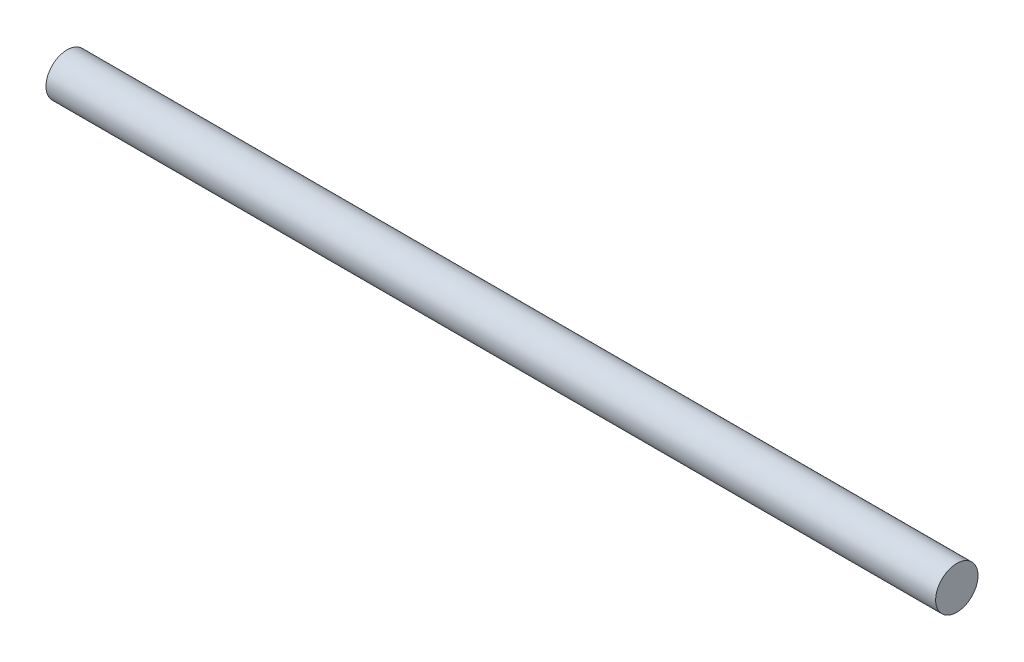
ISO-10303-21;
HEADER;
FILE_DESCRIPTION(('STEP AP214'),'2;1');
FILE_NAME('part.step','',(''),(''),'','','');
FILE_SCHEMA(('AUTOMOTIVE_DESIGN { 1 0 10303 214 1 1 1 1 }'));
ENDSEC;
DATA;
#1=APPLICATION_CONTEXT('core data for automotive mechanical design processes');
#2=APPLICATION_PROTOCOL_DEFINITION('international standard','automotive_design',2000,#1);
#3=PRODUCT_CONTEXT('',#1,'mechanical');
#4=PRODUCT('Part','Part','',(#3));
#5=PRODUCT_RELATED_PRODUCT_CATEGORY('part','',(#4));
#6=PRODUCT_DEFINITION_FORMATION('','',#4);
#7=PRODUCT_DEFINITION_CONTEXT('part definition',#1,'design');
#8=PRODUCT_DEFINITION('design','',#6,#7);
#9=PRODUCT_DEFINITION_SHAPE('','',#8);
#10=(LENGTH_UNIT() NAMED_UNIT(*) SI_UNIT(.MILLI.,.METRE.));
#11=(NAMED_UNIT(*) PLANE_ANGLE_UNIT() SI_UNIT($,.RADIAN.));
#12=(NAMED_UNIT(*) SI_UNIT($,.STERADIAN.) SOLID_ANGLE_UNIT());
#13=UNCERTAINTY_MEASURE_WITH_UNIT(LENGTH_MEASURE(1.E-05),#10,'distance_accuracy_value','');
#14=(GEOMETRIC_REPRESENTATION_CONTEXT(3) GLOBAL_UNCERTAINTY_ASSIGNED_CONTEXT((#13)) GLOBAL_UNIT_ASSIGNED_CONTEXT((#10,
#11,#12)) REPRESENTATION_CONTEXT('',''));
#15=CARTESIAN_POINT('',(0.,0.,0.));
#16=DIRECTION('',(0.,0.,1.));
#17=DIRECTION('',(1.,0.,0.));
#18=AXIS2_PLACEMENT_3D('',#15,#16,#17);
#19=CARTESIAN_POINT('',(200.,0.,0.));
#20=DIRECTION('',(-1.,0.,0.));
#21=DIRECTION('',(0.,0.,1.));
#22=AXIS2_PLACEMENT_3D('',#19,#20,#21);
#23=CYLINDRICAL_SURFACE('',#22,4.7625);
#24=CARTESIAN_POINT('',(200.,0.,0.));
#25=DIRECTION('',(1.,0.,0.));
#26=DIRECTION('',(0.,0.,-1.));
#27=AXIS2_PLACEMENT_3D('',#24,#25,#26);
#28=CIRCLE('',#27,4.7625);
#29=CARTESIAN_POINT('',(200.,0.,-4.7625));
#30=VERTEX_POINT('',#29);
#31=EDGE_CURVE('E10',#30,#30,#28,.T.);
#32=ORIENTED_EDGE('',*,*,#31,.F.);
#33=EDGE_LOOP('',(#32));
#34=FACE_BOUND('',#33,.T.);
#35=CARTESIAN_POINT('',(0.,0.,0.));
#36=DIRECTION('',(1.,0.,0.));
#37=DIRECTION('',(0.,0.,-1.));
#38=AXIS2_PLACEMENT_3D('',#35,#36,#37);
#39=CIRCLE('',#38,4.7625);
#40=CARTESIAN_POINT('',(0.,0.,-4.7625));
#41=VERTEX_POINT('',#40);
#42=EDGE_CURVE('E33',#41,#41,#39,.T.);
#43=ORIENTED_EDGE('',*,*,#42,.T.);
#44=EDGE_LOOP('',(#43));
#45=FACE_BOUND('',#44,.T.);
#46=ADVANCED_FACE('F30',(#34,#45),#23,.T.);
#47=CARTESIAN_POINT('',(200.,0.,0.));
#48=DIRECTION('',(1.,0.,0.));
#49=DIRECTION('',(0.,0.,-1.));
#50=AXIS2_PLACEMENT_3D('',#47,#48,#49);
#51=PLANE('',#50);
#52=ORIENTED_EDGE('',*,*,#31,.T.);
#53=EDGE_LOOP('',(#52));
#54=FACE_BOUND('',#53,.T.);
#55=ADVANCED_FACE('F45',(#54),#51,.T.);
#56=CARTESIAN_POINT('',(0.,0.,0.));
#57=DIRECTION('',(1.,0.,0.));
#58=DIRECTION('',(0.,0.,-1.));
#59=AXIS2_PLACEMENT_3D('',#56,#57,#58);
#60=PLANE('',#59);
#61=ORIENTED_EDGE('',*,*,#42,.F.);
#62=EDGE_LOOP('',(#61));
#63=FACE_BOUND('',#62,.T.);
#64=ADVANCED_FACE('F43',(#63),#60,.F.);
#65=CLOSED_SHELL('',(#46,#55,#64));
#66=MANIFOLD_SOLID_BREP('B2',#65);
#67=ADVANCED_BREP_SHAPE_REPRESENTATION('',(#18,#66),#14);
#68=SHAPE_DEFINITION_REPRESENTATION(#9,#67);
ENDSEC;
END-ISO-10303-21;
